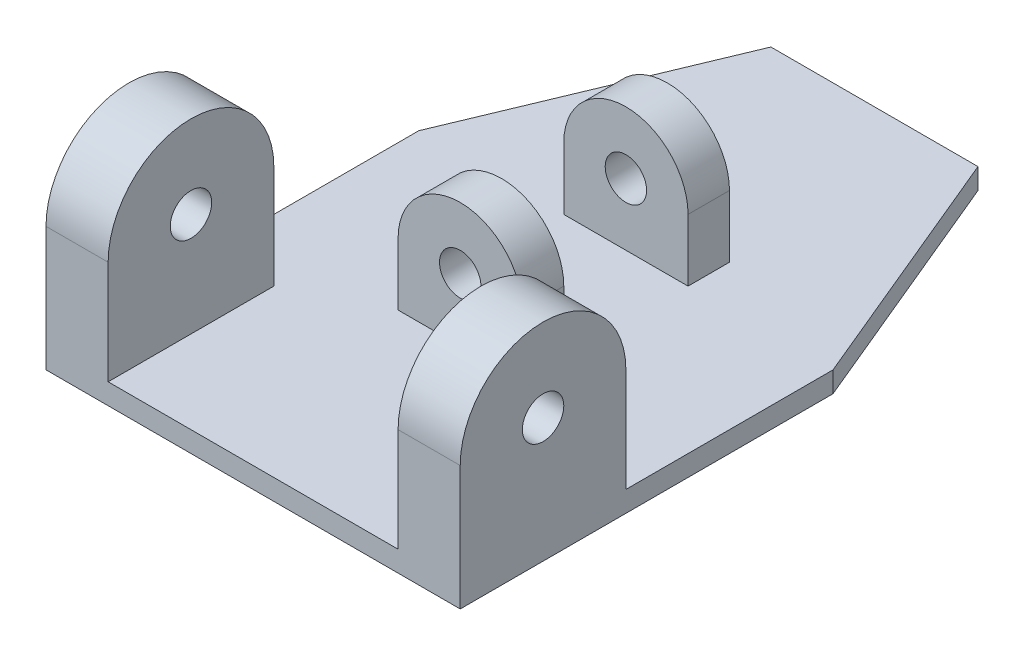
ISO-10303-21;
HEADER;
FILE_DESCRIPTION(('STEP AP214'),'2;1');
FILE_NAME('part.step','',(''),(''),'','','');
FILE_SCHEMA(('AUTOMOTIVE_DESIGN { 1 0 10303 214 1 1 1 1 }'));
ENDSEC;
DATA;
#1=APPLICATION_CONTEXT('core data for automotive mechanical design processes');
#2=APPLICATION_PROTOCOL_DEFINITION('international standard','automotive_design',2000,#1);
#3=PRODUCT_CONTEXT('',#1,'mechanical');
#4=PRODUCT('Part','Part','',(#3));
#5=PRODUCT_RELATED_PRODUCT_CATEGORY('part','',(#4));
#6=PRODUCT_DEFINITION_FORMATION('','',#4);
#7=PRODUCT_DEFINITION_CONTEXT('part definition',#1,'design');
#8=PRODUCT_DEFINITION('design','',#6,#7);
#9=PRODUCT_DEFINITION_SHAPE('','',#8);
#10=(LENGTH_UNIT() NAMED_UNIT(*) SI_UNIT(.MILLI.,.METRE.));
#11=(NAMED_UNIT(*) PLANE_ANGLE_UNIT() SI_UNIT($,.RADIAN.));
#12=(NAMED_UNIT(*) SI_UNIT($,.STERADIAN.) SOLID_ANGLE_UNIT());
#13=UNCERTAINTY_MEASURE_WITH_UNIT(LENGTH_MEASURE(1.E-05),#10,'distance_accuracy_value','');
#14=(GEOMETRIC_REPRESENTATION_CONTEXT(3) GLOBAL_UNCERTAINTY_ASSIGNED_CONTEXT((#13)) GLOBAL_UNIT_ASSIGNED_CONTEXT((#10,
#11,#12)) REPRESENTATION_CONTEXT('',''));
#15=CARTESIAN_POINT('',(0.,0.,0.));
#16=DIRECTION('',(0.,0.,1.));
#17=DIRECTION('',(1.,0.,0.));
#18=AXIS2_PLACEMENT_3D('',#15,#16,#17);
#19=CARTESIAN_POINT('',(-30.,0.,-200.));
#20=DIRECTION('',(-1.,0.,0.));
#21=DIRECTION('',(0.,-1.,0.));
#22=AXIS2_PLACEMENT_3D('',#19,#20,#21);
#23=PLANE('',#22);
#24=DIRECTION('',(0.,0.,1.));
#25=VECTOR('',#24,1.);
#26=CARTESIAN_POINT('',(-30.,40.,-200.));
#27=LINE('',#26,#25);
#28=CARTESIAN_POINT('',(-30.,40.,-120.));
#29=VERTEX_POINT('',#28);
#30=CARTESIAN_POINT('',(-30.,40.,-100.));
#31=VERTEX_POINT('',#30);
#32=EDGE_CURVE('E191',#29,#31,#27,.T.);
#33=ORIENTED_EDGE('',*,*,#32,.F.);
#34=DIRECTION('',(0.,-1.,0.));
#35=VECTOR('',#34,1.);
#36=CARTESIAN_POINT('',(-30.,0.,-120.));
#37=LINE('',#36,#35);
#38=CARTESIAN_POINT('',(-30.,10.,-120.));
#39=VERTEX_POINT('',#38);
#40=EDGE_CURVE('E178',#29,#39,#37,.T.);
#41=ORIENTED_EDGE('',*,*,#40,.T.);
#42=DIRECTION('',(0.,0.,1.));
#43=VECTOR('',#42,1.);
#44=CARTESIAN_POINT('',(-30.,10.,-200.));
#45=LINE('',#44,#43);
#46=CARTESIAN_POINT('',(-30.,10.,-100.));
#47=VERTEX_POINT('',#46);
#48=EDGE_CURVE('E189',#39,#47,#45,.T.);
#49=ORIENTED_EDGE('',*,*,#48,.T.);
#50=DIRECTION('',(0.,-1.,0.));
#51=VECTOR('',#50,1.);
#52=CARTESIAN_POINT('',(-30.,0.,-100.));
#53=LINE('',#52,#51);
#54=EDGE_CURVE('E334',#31,#47,#53,.T.);
#55=ORIENTED_EDGE('',*,*,#54,.F.);
#56=EDGE_LOOP('',(#33,#41,#49,#55));
#57=FACE_BOUND('',#56,.T.);
#58=ADVANCED_FACE('F37',(#57),#23,.T.);
#59=CARTESIAN_POINT('',(0.,40.,-200.));
#60=DIRECTION('',(0.,0.,1.));
#61=DIRECTION('',(1.,0.,0.));
#62=AXIS2_PLACEMENT_3D('',#59,#60,#61);
#63=CYLINDRICAL_SURFACE('',#62,30.);
#64=CARTESIAN_POINT('',(0.,40.,-120.));
#65=DIRECTION('',(0.,0.,-1.));
#66=DIRECTION('',(-1.,0.,0.));
#67=AXIS2_PLACEMENT_3D('',#64,#65,#66);
#68=CIRCLE('',#67,30.);
#69=CARTESIAN_POINT('',(30.,40.,-120.));
#70=VERTEX_POINT('',#69);
#71=EDGE_CURVE('E192',#29,#70,#68,.T.);
#72=ORIENTED_EDGE('',*,*,#71,.F.);
#73=ORIENTED_EDGE('',*,*,#32,.T.);
#74=CARTESIAN_POINT('',(0.,40.,-100.));
#75=DIRECTION('',(0.,0.,1.));
#76=DIRECTION('',(1.,0.,0.));
#77=AXIS2_PLACEMENT_3D('',#74,#75,#76);
#78=CIRCLE('',#77,30.);
#79=CARTESIAN_POINT('',(30.,40.,-100.));
#80=VERTEX_POINT('',#79);
#81=EDGE_CURVE('E325',#31,#80,#78,.F.);
#82=ORIENTED_EDGE('',*,*,#81,.T.);
#83=DIRECTION('',(0.,0.,1.));
#84=VECTOR('',#83,1.);
#85=CARTESIAN_POINT('',(30.,40.,-200.));
#86=LINE('',#85,#84);
#87=EDGE_CURVE('E345',#70,#80,#86,.T.);
#88=ORIENTED_EDGE('',*,*,#87,.F.);
#89=EDGE_LOOP('',(#72,#73,#82,#88));
#90=FACE_BOUND('',#89,.T.);
#91=ADVANCED_FACE('F359',(#90),#63,.T.);
#92=CARTESIAN_POINT('',(30.,0.,-200.));
#93=DIRECTION('',(-1.,0.,0.));
#94=DIRECTION('',(0.,-1.,0.));
#95=AXIS2_PLACEMENT_3D('',#92,#93,#94);
#96=PLANE('',#95);
#97=DIRECTION('',(0.,-1.,0.));
#98=VECTOR('',#97,1.);
#99=CARTESIAN_POINT('',(30.,0.,-120.));
#100=LINE('',#99,#98);
#101=CARTESIAN_POINT('',(30.,10.,-120.));
#102=VERTEX_POINT('',#101);
#103=EDGE_CURVE('E181',#70,#102,#100,.T.);
#104=ORIENTED_EDGE('',*,*,#103,.F.);
#105=ORIENTED_EDGE('',*,*,#87,.T.);
#106=DIRECTION('',(0.,-1.,0.));
#107=VECTOR('',#106,1.);
#108=CARTESIAN_POINT('',(30.,0.,-100.));
#109=LINE('',#108,#107);
#110=CARTESIAN_POINT('',(30.,10.,-100.));
#111=VERTEX_POINT('',#110);
#112=EDGE_CURVE('E337',#80,#111,#109,.T.);
#113=ORIENTED_EDGE('',*,*,#112,.T.);
#114=DIRECTION('',(0.,0.,1.));
#115=VECTOR('',#114,1.);
#116=CARTESIAN_POINT('',(30.,10.,-200.));
#117=LINE('',#116,#115);
#118=EDGE_CURVE('E201',#102,#111,#117,.T.);
#119=ORIENTED_EDGE('',*,*,#118,.F.);
#120=EDGE_LOOP('',(#104,#105,#113,#119));
#121=FACE_BOUND('',#120,.T.);
#122=ADVANCED_FACE('F356',(#121),#96,.F.);
#123=CARTESIAN_POINT('',(0.,40.,-200.));
#124=DIRECTION('',(0.,0.,1.));
#125=DIRECTION('',(1.,0.,0.));
#126=AXIS2_PLACEMENT_3D('',#123,#124,#125);
#127=CYLINDRICAL_SURFACE('',#126,10.);
#128=CARTESIAN_POINT('',(0.,40.,-100.));
#129=DIRECTION('',(0.,0.,1.));
#130=DIRECTION('',(1.,0.,0.));
#131=AXIS2_PLACEMENT_3D('',#128,#129,#130);
#132=CIRCLE('',#131,10.);
#133=CARTESIAN_POINT('',(10.,40.,-100.));
#134=VERTEX_POINT('',#133);
#135=EDGE_CURVE('E320',#134,#134,#132,.T.);
#136=ORIENTED_EDGE('',*,*,#135,.T.);
#137=EDGE_LOOP('',(#136));
#138=FACE_BOUND('',#137,.T.);
#139=CARTESIAN_POINT('',(0.,40.,-120.));
#140=DIRECTION('',(0.,0.,-1.));
#141=DIRECTION('',(-1.,0.,0.));
#142=AXIS2_PLACEMENT_3D('',#139,#140,#141);
#143=CIRCLE('',#142,10.);
#144=CARTESIAN_POINT('',(-10.,40.,-120.));
#145=VERTEX_POINT('',#144);
#146=EDGE_CURVE('E183',#145,#145,#143,.F.);
#147=ORIENTED_EDGE('',*,*,#146,.F.);
#148=EDGE_LOOP('',(#147));
#149=FACE_BOUND('',#148,.T.);
#150=ADVANCED_FACE('F358',(#138,#149),#127,.F.);
#151=CARTESIAN_POINT('',(0.,10.,0.));
#152=DIRECTION('',(0.,1.,0.));
#153=DIRECTION('',(0.,0.,1.));
#154=AXIS2_PLACEMENT_3D('',#151,#152,#153);
#155=PLANE('',#154);
#156=CARTESIAN_POINT('',(30.,10.,-200.));
#157=VERTEX_POINT('',#156);
#158=CARTESIAN_POINT('',(30.,10.,-180.));
#159=VERTEX_POINT('',#158);
#160=EDGE_CURVE('E207',#157,#159,#117,.T.);
#161=ORIENTED_EDGE('',*,*,#160,.T.);
#162=DIRECTION('',(1.,0.,0.));
#163=VECTOR('',#162,1.);
#164=CARTESIAN_POINT('',(-40.,10.,-180.));
#165=LINE('',#164,#163);
#166=CARTESIAN_POINT('',(-30.,10.,-180.));
#167=VERTEX_POINT('',#166);
#168=EDGE_CURVE('E184',#167,#159,#165,.T.);
#169=ORIENTED_EDGE('',*,*,#168,.F.);
#170=CARTESIAN_POINT('',(-30.,10.,-200.));
#171=VERTEX_POINT('',#170);
#172=EDGE_CURVE('E62',#171,#167,#45,.T.);
#173=ORIENTED_EDGE('',*,*,#172,.F.);
#174=DIRECTION('',(-1.,0.,0.));
#175=VECTOR('',#174,1.);
#176=CARTESIAN_POINT('',(0.,10.,-200.));
#177=LINE('',#176,#175);
#178=EDGE_CURVE('E328',#157,#171,#177,.T.);
#179=ORIENTED_EDGE('',*,*,#178,.F.);
#180=EDGE_LOOP('',(#161,#169,#173,#179));
#181=FACE_BOUND('',#180,.T.);
#182=DIRECTION('',(1.,0.,0.));
#183=VECTOR('',#182,1.);
#184=CARTESIAN_POINT('',(-40.,10.,-120.));
#185=LINE('',#184,#183);
#186=EDGE_CURVE('E54',#39,#102,#185,.T.);
#187=ORIENTED_EDGE('',*,*,#186,.T.);
#188=ORIENTED_EDGE('',*,*,#118,.T.);
#189=DIRECTION('',(-1.,0.,0.));
#190=VECTOR('',#189,1.);
#191=CARTESIAN_POINT('',(0.,10.,-100.));
#192=LINE('',#191,#190);
#193=EDGE_CURVE('E197',#111,#47,#192,.T.);
#194=ORIENTED_EDGE('',*,*,#193,.T.);
#195=ORIENTED_EDGE('',*,*,#48,.F.);
#196=EDGE_LOOP('',(#187,#188,#194,#195));
#197=FACE_BOUND('',#196,.T.);
#198=DIRECTION('',(0.,0.,-1.));
#199=VECTOR('',#198,1.);
#200=CARTESIAN_POINT('',(70.,10.,0.));
#201=LINE('',#200,#199);
#202=CARTESIAN_POINT('',(70.,10.,0.));
#203=VERTEX_POINT('',#202);
#204=CARTESIAN_POINT('',(70.,10.,-80.));
#205=VERTEX_POINT('',#204);
#206=EDGE_CURVE('E214',#203,#205,#201,.T.);
#207=ORIENTED_EDGE('',*,*,#206,.T.);
#208=DIRECTION('',(1.,0.,0.));
#209=VECTOR('',#208,1.);
#210=CARTESIAN_POINT('',(-220.415945787923,10.,-80.));
#211=LINE('',#210,#209);
#212=CARTESIAN_POINT('',(100.,10.,-80.));
#213=VERTEX_POINT('',#212);
#214=EDGE_CURVE('E260',#205,#213,#211,.T.);
#215=ORIENTED_EDGE('',*,*,#214,.T.);
#216=DIRECTION('',(0.,0.,-1.));
#217=VECTOR('',#216,1.);
#218=CARTESIAN_POINT('',(100.,10.,0.));
#219=LINE('',#218,#217);
#220=CARTESIAN_POINT('',(100.,10.,-180.));
#221=VERTEX_POINT('',#220);
#222=EDGE_CURVE('E264',#213,#221,#219,.T.);
#223=ORIENTED_EDGE('',*,*,#222,.T.);
#224=DIRECTION('',(-0.384615384615385,0.,-0.923076923076923));
#225=VECTOR('',#224,1.);
#226=CARTESIAN_POINT('',(100.,10.,-180.));
#227=LINE('',#226,#225);
#228=CARTESIAN_POINT('',(50.,10.,-300.));
#229=VERTEX_POINT('',#228);
#230=EDGE_CURVE('E266',#221,#229,#227,.T.);
#231=ORIENTED_EDGE('',*,*,#230,.T.);
#232=DIRECTION('',(-1.,0.,0.));
#233=VECTOR('',#232,1.);
#234=CARTESIAN_POINT('',(50.,10.,-300.));
#235=LINE('',#234,#233);
#236=CARTESIAN_POINT('',(-50.,10.,-300.));
#237=VERTEX_POINT('',#236);
#238=EDGE_CURVE('E269',#229,#237,#235,.T.);
#239=ORIENTED_EDGE('',*,*,#238,.T.);
#240=DIRECTION('',(-0.384615384615385,0.,0.923076923076923));
#241=VECTOR('',#240,1.);
#242=CARTESIAN_POINT('',(-100.,10.,-180.));
#243=LINE('',#242,#241);
#244=CARTESIAN_POINT('',(-100.,10.,-180.));
#245=VERTEX_POINT('',#244);
#246=EDGE_CURVE('E271',#237,#245,#243,.T.);
#247=ORIENTED_EDGE('',*,*,#246,.T.);
#248=DIRECTION('',(0.,0.,1.));
#249=VECTOR('',#248,1.);
#250=CARTESIAN_POINT('',(-100.,10.,0.));
#251=LINE('',#250,#249);
#252=CARTESIAN_POINT('',(-100.,10.,-80.));
#253=VERTEX_POINT('',#252);
#254=EDGE_CURVE('E273',#245,#253,#251,.T.);
#255=ORIENTED_EDGE('',*,*,#254,.T.);
#256=CARTESIAN_POINT('',(-70.,10.,-80.));
#257=VERTEX_POINT('',#256);
#258=EDGE_CURVE('E257',#253,#257,#211,.T.);
#259=ORIENTED_EDGE('',*,*,#258,.T.);
#260=DIRECTION('',(0.,0.,1.));
#261=VECTOR('',#260,1.);
#262=CARTESIAN_POINT('',(-70.,10.,0.));
#263=LINE('',#262,#261);
#264=CARTESIAN_POINT('',(-70.,10.,0.));
#265=VERTEX_POINT('',#264);
#266=EDGE_CURVE('E209',#257,#265,#263,.T.);
#267=ORIENTED_EDGE('',*,*,#266,.T.);
#268=DIRECTION('',(1.,0.,0.));
#269=VECTOR('',#268,1.);
#270=CARTESIAN_POINT('',(-70.,10.,0.));
#271=LINE('',#270,#269);
#272=EDGE_CURVE('E211',#265,#203,#271,.T.);
#273=ORIENTED_EDGE('',*,*,#272,.T.);
#274=EDGE_LOOP('',(#207,#215,#223,#231,#239,#247,#255,#259,#267,#273));
#275=FACE_BOUND('',#274,.T.);
#276=ADVANCED_FACE('F194',(#181,#197,#275),#155,.T.);
#277=CARTESIAN_POINT('',(-100.,10.,0.));
#278=DIRECTION('',(0.,0.,-1.));
#279=DIRECTION('',(-1.,0.,0.));
#280=AXIS2_PLACEMENT_3D('',#277,#278,#279);
#281=PLANE('',#280);
#282=DIRECTION('',(0.,-1.,0.));
#283=VECTOR('',#282,1.);
#284=CARTESIAN_POINT('',(-70.,181.,0.));
#285=LINE('',#284,#283);
#286=CARTESIAN_POINT('',(-70.,60.,0.));
#287=VERTEX_POINT('',#286);
#288=EDGE_CURVE('E220',#287,#265,#285,.T.);
#289=ORIENTED_EDGE('',*,*,#288,.F.);
#290=DIRECTION('',(1.,0.,0.));
#291=VECTOR('',#290,1.);
#292=CARTESIAN_POINT('',(-220.415945787923,60.,0.));
#293=LINE('',#292,#291);
#294=CARTESIAN_POINT('',(-100.,60.,0.));
#295=VERTEX_POINT('',#294);
#296=EDGE_CURVE('E261',#295,#287,#293,.T.);
#297=ORIENTED_EDGE('',*,*,#296,.F.);
#298=DIRECTION('',(0.,-1.,0.));
#299=VECTOR('',#298,1.);
#300=CARTESIAN_POINT('',(-100.,10.,0.));
#301=LINE('',#300,#299);
#302=CARTESIAN_POINT('',(-100.,0.,0.));
#303=VERTEX_POINT('',#302);
#304=EDGE_CURVE('E290',#295,#303,#301,.T.);
#305=ORIENTED_EDGE('',*,*,#304,.T.);
#306=DIRECTION('',(1.,0.,0.));
#307=VECTOR('',#306,1.);
#308=CARTESIAN_POINT('',(-100.,0.,0.));
#309=LINE('',#308,#307);
#310=CARTESIAN_POINT('',(100.,0.,0.));
#311=VERTEX_POINT('',#310);
#312=EDGE_CURVE('E267',#303,#311,#309,.T.);
#313=ORIENTED_EDGE('',*,*,#312,.T.);
#314=DIRECTION('',(0.,-1.,0.));
#315=VECTOR('',#314,1.);
#316=CARTESIAN_POINT('',(100.,10.,0.));
#317=LINE('',#316,#315);
#318=CARTESIAN_POINT('',(100.,60.,0.));
#319=VERTEX_POINT('',#318);
#320=EDGE_CURVE('E276',#319,#311,#317,.T.);
#321=ORIENTED_EDGE('',*,*,#320,.F.);
#322=CARTESIAN_POINT('',(70.,60.,0.));
#323=VERTEX_POINT('',#322);
#324=EDGE_CURVE('E253',#323,#319,#293,.T.);
#325=ORIENTED_EDGE('',*,*,#324,.F.);
#326=DIRECTION('',(0.,-1.,0.));
#327=VECTOR('',#326,1.);
#328=CARTESIAN_POINT('',(70.,181.,0.));
#329=LINE('',#328,#327);
#330=EDGE_CURVE('E217',#323,#203,#329,.T.);
#331=ORIENTED_EDGE('',*,*,#330,.T.);
#332=ORIENTED_EDGE('',*,*,#272,.F.);
#333=EDGE_LOOP('',(#289,#297,#305,#313,#321,#325,#331,#332));
#334=FACE_BOUND('',#333,.T.);
#335=ADVANCED_FACE('F396',(#334),#281,.F.);
#336=CARTESIAN_POINT('',(-220.415945787923,60.,-40.));
#337=DIRECTION('',(1.,0.,0.));
#338=DIRECTION('',(0.,0.,-1.));
#339=AXIS2_PLACEMENT_3D('',#336,#337,#338);
#340=CYLINDRICAL_SURFACE('',#339,10.);
#341=CARTESIAN_POINT('',(-100.,60.,-40.));
#342=DIRECTION('',(1.,0.,0.));
#343=DIRECTION('',(0.,0.,-1.));
#344=AXIS2_PLACEMENT_3D('',#341,#342,#343);
#345=CIRCLE('',#344,10.);
#346=CARTESIAN_POINT('',(-100.,60.,-50.));
#347=VERTEX_POINT('',#346);
#348=EDGE_CURVE('E241',#347,#347,#345,.F.);
#349=ORIENTED_EDGE('',*,*,#348,.T.);
#350=EDGE_LOOP('',(#349));
#351=FACE_BOUND('',#350,.T.);
#352=CARTESIAN_POINT('',(-70.,60.,-40.));
#353=DIRECTION('',(1.,0.,0.));
#354=DIRECTION('',(0.,0.,-1.));
#355=AXIS2_PLACEMENT_3D('',#352,#353,#354);
#356=CIRCLE('',#355,10.);
#357=CARTESIAN_POINT('',(-70.,60.,-50.));
#358=VERTEX_POINT('',#357);
#359=EDGE_CURVE('E232',#358,#358,#356,.F.);
#360=ORIENTED_EDGE('',*,*,#359,.F.);
#361=EDGE_LOOP('',(#360));
#362=FACE_BOUND('',#361,.T.);
#363=ADVANCED_FACE('F401',(#351,#362),#340,.F.);
#364=CARTESIAN_POINT('',(100.,60.,-40.));
#365=DIRECTION('',(1.,0.,0.));
#366=DIRECTION('',(0.,0.,-1.));
#367=AXIS2_PLACEMENT_3D('',#364,#365,#366);
#368=CIRCLE('',#367,10.);
#369=CARTESIAN_POINT('',(100.,60.,-50.));
#370=VERTEX_POINT('',#369);
#371=EDGE_CURVE('E235',#370,#370,#368,.T.);
#372=ORIENTED_EDGE('',*,*,#371,.T.);
#373=EDGE_LOOP('',(#372));
#374=FACE_BOUND('',#373,.T.);
#375=CARTESIAN_POINT('',(70.,60.,-40.));
#376=DIRECTION('',(-1.,0.,0.));
#377=DIRECTION('',(0.,0.,1.));
#378=AXIS2_PLACEMENT_3D('',#375,#376,#377);
#379=CIRCLE('',#378,10.);
#380=CARTESIAN_POINT('',(70.,60.,-30.));
#381=VERTEX_POINT('',#380);
#382=EDGE_CURVE('E226',#381,#381,#379,.F.);
#383=ORIENTED_EDGE('',*,*,#382,.F.);
#384=EDGE_LOOP('',(#383));
#385=FACE_BOUND('',#384,.T.);
#386=ADVANCED_FACE('F476',(#374,#385),#340,.F.);
#387=CARTESIAN_POINT('',(-220.415945787923,0.,-80.));
#388=DIRECTION('',(0.,0.,-1.));
#389=DIRECTION('',(0.,1.,0.));
#390=AXIS2_PLACEMENT_3D('',#387,#388,#389);
#391=PLANE('',#390);
#392=DIRECTION('',(1.,0.,0.));
#393=VECTOR('',#392,1.);
#394=CARTESIAN_POINT('',(-220.415945787923,60.,-80.));
#395=LINE('',#394,#393);
#396=CARTESIAN_POINT('',(-100.,60.,-80.));
#397=VERTEX_POINT('',#396);
#398=CARTESIAN_POINT('',(-70.,60.,-80.));
#399=VERTEX_POINT('',#398);
#400=EDGE_CURVE('E239',#397,#399,#395,.T.);
#401=ORIENTED_EDGE('',*,*,#400,.T.);
#402=DIRECTION('',(0.,-1.,0.));
#403=VECTOR('',#402,1.);
#404=CARTESIAN_POINT('',(-70.,0.,-80.));
#405=LINE('',#404,#403);
#406=EDGE_CURVE('E229',#399,#257,#405,.T.);
#407=ORIENTED_EDGE('',*,*,#406,.T.);
#408=ORIENTED_EDGE('',*,*,#258,.F.);
#409=DIRECTION('',(0.,-1.,0.));
#410=VECTOR('',#409,1.);
#411=CARTESIAN_POINT('',(-100.,0.,-80.));
#412=LINE('',#411,#410);
#413=EDGE_CURVE('E236',#397,#253,#412,.T.);
#414=ORIENTED_EDGE('',*,*,#413,.F.);
#415=EDGE_LOOP('',(#401,#407,#408,#414));
#416=FACE_BOUND('',#415,.T.);
#417=ADVANCED_FACE('F457',(#416),#391,.T.);
#418=ORIENTED_EDGE('',*,*,#214,.F.);
#419=DIRECTION('',(0.,1.,0.));
#420=VECTOR('',#419,1.);
#421=CARTESIAN_POINT('',(70.,0.,-80.));
#422=LINE('',#421,#420);
#423=CARTESIAN_POINT('',(70.,60.,-80.));
#424=VERTEX_POINT('',#423);
#425=EDGE_CURVE('E223',#205,#424,#422,.T.);
#426=ORIENTED_EDGE('',*,*,#425,.T.);
#427=CARTESIAN_POINT('',(100.,60.,-80.));
#428=VERTEX_POINT('',#427);
#429=EDGE_CURVE('E256',#424,#428,#395,.T.);
#430=ORIENTED_EDGE('',*,*,#429,.T.);
#431=DIRECTION('',(0.,1.,0.));
#432=VECTOR('',#431,1.);
#433=CARTESIAN_POINT('',(100.,0.,-80.));
#434=LINE('',#433,#432);
#435=EDGE_CURVE('E250',#213,#428,#434,.T.);
#436=ORIENTED_EDGE('',*,*,#435,.F.);
#437=EDGE_LOOP('',(#418,#426,#430,#436));
#438=FACE_BOUND('',#437,.T.);
#439=ADVANCED_FACE('F468',(#438),#391,.T.);
#440=CARTESIAN_POINT('',(-220.415945787923,60.,-40.));
#441=DIRECTION('',(1.,0.,0.));
#442=DIRECTION('',(0.,0.,-1.));
#443=AXIS2_PLACEMENT_3D('',#440,#441,#442);
#444=CYLINDRICAL_SURFACE('',#443,40.);
#445=ORIENTED_EDGE('',*,*,#296,.T.);
#446=CARTESIAN_POINT('',(-70.,60.,-40.));
#447=DIRECTION('',(1.,0.,0.));
#448=DIRECTION('',(0.,0.,-1.));
#449=AXIS2_PLACEMENT_3D('',#446,#447,#448);
#450=CIRCLE('',#449,40.);
#451=EDGE_CURVE('E11',#287,#399,#450,.F.);
#452=ORIENTED_EDGE('',*,*,#451,.T.);
#453=ORIENTED_EDGE('',*,*,#400,.F.);
#454=CARTESIAN_POINT('',(-100.,60.,-40.));
#455=DIRECTION('',(1.,0.,0.));
#456=DIRECTION('',(0.,0.,-1.));
#457=AXIS2_PLACEMENT_3D('',#454,#455,#456);
#458=CIRCLE('',#457,40.);
#459=EDGE_CURVE('E238',#295,#397,#458,.F.);
#460=ORIENTED_EDGE('',*,*,#459,.F.);
#461=EDGE_LOOP('',(#445,#452,#453,#460));
#462=FACE_BOUND('',#461,.T.);
#463=ADVANCED_FACE('F455',(#462),#444,.T.);
#464=ORIENTED_EDGE('',*,*,#429,.F.);
#465=CARTESIAN_POINT('',(70.,60.,-40.));
#466=DIRECTION('',(-1.,0.,0.));
#467=DIRECTION('',(0.,0.,1.));
#468=AXIS2_PLACEMENT_3D('',#465,#466,#467);
#469=CIRCLE('',#468,40.);
#470=EDGE_CURVE('E46',#424,#323,#469,.F.);
#471=ORIENTED_EDGE('',*,*,#470,.T.);
#472=ORIENTED_EDGE('',*,*,#324,.T.);
#473=CARTESIAN_POINT('',(100.,60.,-40.));
#474=DIRECTION('',(1.,0.,0.));
#475=DIRECTION('',(0.,0.,-1.));
#476=AXIS2_PLACEMENT_3D('',#473,#474,#475);
#477=CIRCLE('',#476,40.);
#478=EDGE_CURVE('E247',#428,#319,#477,.T.);
#479=ORIENTED_EDGE('',*,*,#478,.F.);
#480=EDGE_LOOP('',(#464,#471,#472,#479));
#481=FACE_BOUND('',#480,.T.);
#482=ADVANCED_FACE('F428',(#481),#444,.T.);
#483=CARTESIAN_POINT('',(100.,10.,0.));
#484=DIRECTION('',(-1.,0.,0.));
#485=DIRECTION('',(0.,0.,1.));
#486=AXIS2_PLACEMENT_3D('',#483,#484,#485);
#487=PLANE('',#486);
#488=DIRECTION('',(0.,0.,-1.));
#489=VECTOR('',#488,1.);
#490=CARTESIAN_POINT('',(100.,0.,0.));
#491=LINE('',#490,#489);
#492=CARTESIAN_POINT('',(100.,0.,-180.));
#493=VERTEX_POINT('',#492);
#494=EDGE_CURVE('E244',#311,#493,#491,.T.);
#495=ORIENTED_EDGE('',*,*,#494,.T.);
#496=DIRECTION('',(0.,-1.,0.));
#497=VECTOR('',#496,1.);
#498=CARTESIAN_POINT('',(100.,10.,-180.));
#499=LINE('',#498,#497);
#500=EDGE_CURVE('E302',#221,#493,#499,.T.);
#501=ORIENTED_EDGE('',*,*,#500,.F.);
#502=ORIENTED_EDGE('',*,*,#222,.F.);
#503=ORIENTED_EDGE('',*,*,#435,.T.);
#504=ORIENTED_EDGE('',*,*,#478,.T.);
#505=ORIENTED_EDGE('',*,*,#320,.T.);
#506=EDGE_LOOP('',(#495,#501,#502,#503,#504,#505));
#507=FACE_BOUND('',#506,.T.);
#508=ORIENTED_EDGE('',*,*,#371,.F.);
#509=EDGE_LOOP('',(#508));
#510=FACE_BOUND('',#509,.T.);
#511=ADVANCED_FACE('F39',(#507,#510),#487,.F.);
#512=CARTESIAN_POINT('',(100.,10.,-180.));
#513=DIRECTION('',(-0.923076923076923,0.,0.384615384615385));
#514=DIRECTION('',(0.384615384615385,0.,0.923076923076923));
#515=AXIS2_PLACEMENT_3D('',#512,#513,#514);
#516=PLANE('',#515);
#517=DIRECTION('',(-0.384615384615385,0.,-0.923076923076923));
#518=VECTOR('',#517,1.);
#519=CARTESIAN_POINT('',(100.,0.,-180.));
#520=LINE('',#519,#518);
#521=CARTESIAN_POINT('',(50.,0.,-300.));
#522=VERTEX_POINT('',#521);
#523=EDGE_CURVE('E279',#493,#522,#520,.T.);
#524=ORIENTED_EDGE('',*,*,#523,.T.);
#525=DIRECTION('',(0.,-1.,0.));
#526=VECTOR('',#525,1.);
#527=CARTESIAN_POINT('',(50.,10.,-300.));
#528=LINE('',#527,#526);
#529=EDGE_CURVE('E299',#229,#522,#528,.T.);
#530=ORIENTED_EDGE('',*,*,#529,.F.);
#531=ORIENTED_EDGE('',*,*,#230,.F.);
#532=ORIENTED_EDGE('',*,*,#500,.T.);
#533=EDGE_LOOP('',(#524,#530,#531,#532));
#534=FACE_BOUND('',#533,.T.);
#535=ADVANCED_FACE('F421',(#534),#516,.F.);
#536=CARTESIAN_POINT('',(50.,10.,-300.));
#537=DIRECTION('',(0.,0.,1.));
#538=DIRECTION('',(1.,0.,0.));
#539=AXIS2_PLACEMENT_3D('',#536,#537,#538);
#540=PLANE('',#539);
#541=DIRECTION('',(-1.,0.,0.));
#542=VECTOR('',#541,1.);
#543=CARTESIAN_POINT('',(50.,0.,-300.));
#544=LINE('',#543,#542);
#545=CARTESIAN_POINT('',(-50.,0.,-300.));
#546=VERTEX_POINT('',#545);
#547=EDGE_CURVE('E281',#522,#546,#544,.T.);
#548=ORIENTED_EDGE('',*,*,#547,.T.);
#549=DIRECTION('',(0.,-1.,0.));
#550=VECTOR('',#549,1.);
#551=CARTESIAN_POINT('',(-50.,10.,-300.));
#552=LINE('',#551,#550);
#553=EDGE_CURVE('E296',#237,#546,#552,.T.);
#554=ORIENTED_EDGE('',*,*,#553,.F.);
#555=ORIENTED_EDGE('',*,*,#238,.F.);
#556=ORIENTED_EDGE('',*,*,#529,.T.);
#557=EDGE_LOOP('',(#548,#554,#555,#556));
#558=FACE_BOUND('',#557,.T.);
#559=ADVANCED_FACE('F418',(#558),#540,.F.);
#560=CARTESIAN_POINT('',(-100.,10.,-180.));
#561=DIRECTION('',(0.923076923076923,0.,0.384615384615385));
#562=DIRECTION('',(0.384615384615385,0.,-0.923076923076923));
#563=AXIS2_PLACEMENT_3D('',#560,#561,#562);
#564=PLANE('',#563);
#565=DIRECTION('',(-0.384615384615385,0.,0.923076923076923));
#566=VECTOR('',#565,1.);
#567=CARTESIAN_POINT('',(-100.,0.,-180.));
#568=LINE('',#567,#566);
#569=CARTESIAN_POINT('',(-100.,0.,-180.));
#570=VERTEX_POINT('',#569);
#571=EDGE_CURVE('E283',#546,#570,#568,.T.);
#572=ORIENTED_EDGE('',*,*,#571,.T.);
#573=DIRECTION('',(0.,-1.,0.));
#574=VECTOR('',#573,1.);
#575=CARTESIAN_POINT('',(-100.,10.,-180.));
#576=LINE('',#575,#574);
#577=EDGE_CURVE('E293',#245,#570,#576,.T.);
#578=ORIENTED_EDGE('',*,*,#577,.F.);
#579=ORIENTED_EDGE('',*,*,#246,.F.);
#580=ORIENTED_EDGE('',*,*,#553,.T.);
#581=EDGE_LOOP('',(#572,#578,#579,#580));
#582=FACE_BOUND('',#581,.T.);
#583=ADVANCED_FACE('F414',(#582),#564,.F.);
#584=CARTESIAN_POINT('',(-100.,10.,0.));
#585=DIRECTION('',(1.,0.,0.));
#586=DIRECTION('',(0.,0.,-1.));
#587=AXIS2_PLACEMENT_3D('',#584,#585,#586);
#588=PLANE('',#587);
#589=DIRECTION('',(0.,0.,1.));
#590=VECTOR('',#589,1.);
#591=CARTESIAN_POINT('',(-100.,0.,0.));
#592=LINE('',#591,#590);
#593=EDGE_CURVE('E285',#570,#303,#592,.T.);
#594=ORIENTED_EDGE('',*,*,#593,.T.);
#595=ORIENTED_EDGE('',*,*,#304,.F.);
#596=ORIENTED_EDGE('',*,*,#459,.T.);
#597=ORIENTED_EDGE('',*,*,#413,.T.);
#598=ORIENTED_EDGE('',*,*,#254,.F.);
#599=ORIENTED_EDGE('',*,*,#577,.T.);
#600=EDGE_LOOP('',(#594,#595,#596,#597,#598,#599));
#601=FACE_BOUND('',#600,.T.);
#602=ORIENTED_EDGE('',*,*,#348,.F.);
#603=EDGE_LOOP('',(#602));
#604=FACE_BOUND('',#603,.T.);
#605=ADVANCED_FACE('F409',(#601,#604),#588,.F.);
#606=CARTESIAN_POINT('',(0.,0.,0.));
#607=DIRECTION('',(0.,1.,0.));
#608=DIRECTION('',(0.,0.,1.));
#609=AXIS2_PLACEMENT_3D('',#606,#607,#608);
#610=PLANE('',#609);
#611=ORIENTED_EDGE('',*,*,#494,.F.);
#612=ORIENTED_EDGE('',*,*,#312,.F.);
#613=ORIENTED_EDGE('',*,*,#593,.F.);
#614=ORIENTED_EDGE('',*,*,#571,.F.);
#615=ORIENTED_EDGE('',*,*,#547,.F.);
#616=ORIENTED_EDGE('',*,*,#523,.F.);
#617=EDGE_LOOP('',(#611,#612,#613,#614,#615,#616));
#618=FACE_BOUND('',#617,.T.);
#619=ADVANCED_FACE('F407',(#618),#610,.F.);
#620=CARTESIAN_POINT('',(-70.,181.,0.));
#621=DIRECTION('',(1.,0.,0.));
#622=DIRECTION('',(0.,0.,-1.));
#623=AXIS2_PLACEMENT_3D('',#620,#621,#622);
#624=PLANE('',#623);
#625=ORIENTED_EDGE('',*,*,#451,.F.);
#626=ORIENTED_EDGE('',*,*,#288,.T.);
#627=ORIENTED_EDGE('',*,*,#266,.F.);
#628=ORIENTED_EDGE('',*,*,#406,.F.);
#629=EDGE_LOOP('',(#625,#626,#627,#628));
#630=FACE_BOUND('',#629,.T.);
#631=ORIENTED_EDGE('',*,*,#359,.T.);
#632=EDGE_LOOP('',(#631));
#633=FACE_BOUND('',#632,.T.);
#634=ADVANCED_FACE('F386',(#630,#633),#624,.T.);
#635=CARTESIAN_POINT('',(70.,181.,0.));
#636=DIRECTION('',(-1.,0.,0.));
#637=DIRECTION('',(0.,0.,1.));
#638=AXIS2_PLACEMENT_3D('',#635,#636,#637);
#639=PLANE('',#638);
#640=ORIENTED_EDGE('',*,*,#206,.F.);
#641=ORIENTED_EDGE('',*,*,#330,.F.);
#642=ORIENTED_EDGE('',*,*,#470,.F.);
#643=ORIENTED_EDGE('',*,*,#425,.F.);
#644=EDGE_LOOP('',(#640,#641,#642,#643));
#645=FACE_BOUND('',#644,.T.);
#646=ORIENTED_EDGE('',*,*,#382,.T.);
#647=EDGE_LOOP('',(#646));
#648=FACE_BOUND('',#647,.T.);
#649=ADVANCED_FACE('F379',(#645,#648),#639,.T.);
#650=DIRECTION('',(0.,-1.,0.));
#651=VECTOR('',#650,1.);
#652=CARTESIAN_POINT('',(-30.,0.,-180.));
#653=LINE('',#652,#651);
#654=CARTESIAN_POINT('',(-30.,40.,-180.));
#655=VERTEX_POINT('',#654);
#656=EDGE_CURVE('E318',#655,#167,#653,.T.);
#657=ORIENTED_EDGE('',*,*,#656,.F.);
#658=CARTESIAN_POINT('',(-30.,40.,-200.));
#659=VERTEX_POINT('',#658);
#660=EDGE_CURVE('E212',#659,#655,#27,.T.);
#661=ORIENTED_EDGE('',*,*,#660,.F.);
#662=DIRECTION('',(0.,-1.,0.));
#663=VECTOR('',#662,1.);
#664=CARTESIAN_POINT('',(-30.,0.,-200.));
#665=LINE('',#664,#663);
#666=EDGE_CURVE('E324',#659,#171,#665,.T.);
#667=ORIENTED_EDGE('',*,*,#666,.T.);
#668=ORIENTED_EDGE('',*,*,#172,.T.);
#669=EDGE_LOOP('',(#657,#661,#667,#668));
#670=FACE_BOUND('',#669,.T.);
#671=ADVANCED_FACE('F375',(#670),#23,.T.);
#672=ORIENTED_EDGE('',*,*,#660,.T.);
#673=CARTESIAN_POINT('',(0.,40.,-180.));
#674=DIRECTION('',(0.,0.,-1.));
#675=DIRECTION('',(-1.,0.,0.));
#676=AXIS2_PLACEMENT_3D('',#673,#674,#675);
#677=CIRCLE('',#676,30.);
#678=CARTESIAN_POINT('',(30.,40.,-180.));
#679=VERTEX_POINT('',#678);
#680=EDGE_CURVE('E315',#655,#679,#677,.T.);
#681=ORIENTED_EDGE('',*,*,#680,.T.);
#682=CARTESIAN_POINT('',(30.,40.,-200.));
#683=VERTEX_POINT('',#682);
#684=EDGE_CURVE('E343',#683,#679,#86,.T.);
#685=ORIENTED_EDGE('',*,*,#684,.F.);
#686=CARTESIAN_POINT('',(0.,40.,-200.));
#687=DIRECTION('',(0.,0.,1.));
#688=DIRECTION('',(1.,0.,0.));
#689=AXIS2_PLACEMENT_3D('',#686,#687,#688);
#690=CIRCLE('',#689,30.);
#691=EDGE_CURVE('E199',#659,#683,#690,.F.);
#692=ORIENTED_EDGE('',*,*,#691,.F.);
#693=EDGE_LOOP('',(#672,#681,#685,#692));
#694=FACE_BOUND('',#693,.T.);
#695=ADVANCED_FACE('F371',(#694),#63,.T.);
#696=ORIENTED_EDGE('',*,*,#684,.T.);
#697=DIRECTION('',(0.,-1.,0.));
#698=VECTOR('',#697,1.);
#699=CARTESIAN_POINT('',(30.,0.,-180.));
#700=LINE('',#699,#698);
#701=EDGE_CURVE('E312',#679,#159,#700,.T.);
#702=ORIENTED_EDGE('',*,*,#701,.T.);
#703=ORIENTED_EDGE('',*,*,#160,.F.);
#704=DIRECTION('',(0.,-1.,0.));
#705=VECTOR('',#704,1.);
#706=CARTESIAN_POINT('',(30.,0.,-200.));
#707=LINE('',#706,#705);
#708=EDGE_CURVE('E203',#683,#157,#707,.T.);
#709=ORIENTED_EDGE('',*,*,#708,.F.);
#710=EDGE_LOOP('',(#696,#702,#703,#709));
#711=FACE_BOUND('',#710,.T.);
#712=ADVANCED_FACE('F361',(#711),#96,.F.);
#713=CARTESIAN_POINT('',(0.,40.,-180.));
#714=DIRECTION('',(0.,0.,-1.));
#715=DIRECTION('',(-1.,0.,0.));
#716=AXIS2_PLACEMENT_3D('',#713,#714,#715);
#717=CIRCLE('',#716,10.);
#718=CARTESIAN_POINT('',(-10.,40.,-180.));
#719=VERTEX_POINT('',#718);
#720=EDGE_CURVE('E41',#719,#719,#717,.F.);
#721=ORIENTED_EDGE('',*,*,#720,.T.);
#722=EDGE_LOOP('',(#721));
#723=FACE_BOUND('',#722,.T.);
#724=CARTESIAN_POINT('',(0.,40.,-200.));
#725=DIRECTION('',(0.,0.,1.));
#726=DIRECTION('',(1.,0.,0.));
#727=AXIS2_PLACEMENT_3D('',#724,#725,#726);
#728=CIRCLE('',#727,10.);
#729=CARTESIAN_POINT('',(10.,40.,-200.));
#730=VERTEX_POINT('',#729);
#731=EDGE_CURVE('E321',#730,#730,#728,.T.);
#732=ORIENTED_EDGE('',*,*,#731,.F.);
#733=EDGE_LOOP('',(#732));
#734=FACE_BOUND('',#733,.T.);
#735=ADVANCED_FACE('F368',(#723,#734),#127,.F.);
#736=CARTESIAN_POINT('',(0.,0.,-200.));
#737=DIRECTION('',(0.,0.,1.));
#738=DIRECTION('',(1.,0.,0.));
#739=AXIS2_PLACEMENT_3D('',#736,#737,#738);
#740=PLANE('',#739);
#741=ORIENTED_EDGE('',*,*,#731,.T.);
#742=EDGE_LOOP('',(#741));
#743=FACE_BOUND('',#742,.T.);
#744=ORIENTED_EDGE('',*,*,#666,.F.);
#745=ORIENTED_EDGE('',*,*,#691,.T.);
#746=ORIENTED_EDGE('',*,*,#708,.T.);
#747=ORIENTED_EDGE('',*,*,#178,.T.);
#748=EDGE_LOOP('',(#744,#745,#746,#747));
#749=FACE_BOUND('',#748,.T.);
#750=ADVANCED_FACE('F394',(#743,#749),#740,.F.);
#751=CARTESIAN_POINT('',(0.,0.,-100.));
#752=DIRECTION('',(0.,0.,1.));
#753=DIRECTION('',(1.,0.,0.));
#754=AXIS2_PLACEMENT_3D('',#751,#752,#753);
#755=PLANE('',#754);
#756=ORIENTED_EDGE('',*,*,#135,.F.);
#757=EDGE_LOOP('',(#756));
#758=FACE_BOUND('',#757,.T.);
#759=ORIENTED_EDGE('',*,*,#54,.T.);
#760=ORIENTED_EDGE('',*,*,#193,.F.);
#761=ORIENTED_EDGE('',*,*,#112,.F.);
#762=ORIENTED_EDGE('',*,*,#81,.F.);
#763=EDGE_LOOP('',(#759,#760,#761,#762));
#764=FACE_BOUND('',#763,.T.);
#765=ADVANCED_FACE('F354',(#758,#764),#755,.T.);
#766=CARTESIAN_POINT('',(-40.,120.,-180.));
#767=DIRECTION('',(0.,0.,-1.));
#768=DIRECTION('',(-1.,0.,0.));
#769=AXIS2_PLACEMENT_3D('',#766,#767,#768);
#770=PLANE('',#769);
#771=ORIENTED_EDGE('',*,*,#656,.T.);
#772=ORIENTED_EDGE('',*,*,#168,.T.);
#773=ORIENTED_EDGE('',*,*,#701,.F.);
#774=ORIENTED_EDGE('',*,*,#680,.F.);
#775=EDGE_LOOP('',(#771,#772,#773,#774));
#776=FACE_BOUND('',#775,.T.);
#777=ORIENTED_EDGE('',*,*,#720,.F.);
#778=EDGE_LOOP('',(#777));
#779=FACE_BOUND('',#778,.T.);
#780=ADVANCED_FACE('F491',(#776,#779),#770,.F.);
#781=CARTESIAN_POINT('',(-40.,120.,-120.));
#782=DIRECTION('',(0.,0.,-1.));
#783=DIRECTION('',(-1.,0.,0.));
#784=AXIS2_PLACEMENT_3D('',#781,#782,#783);
#785=PLANE('',#784);
#786=ORIENTED_EDGE('',*,*,#71,.T.);
#787=ORIENTED_EDGE('',*,*,#103,.T.);
#788=ORIENTED_EDGE('',*,*,#186,.F.);
#789=ORIENTED_EDGE('',*,*,#40,.F.);
#790=EDGE_LOOP('',(#786,#787,#788,#789));
#791=FACE_BOUND('',#790,.T.);
#792=ORIENTED_EDGE('',*,*,#146,.T.);
#793=EDGE_LOOP('',(#792));
#794=FACE_BOUND('',#793,.T.);
#795=ADVANCED_FACE('F176',(#791,#794),#785,.T.);
#796=CLOSED_SHELL('',(#58,#91,#122,#150,#276,#335,#363,#386,#417,#439,#463,#482,#511,#535,#559,
#583,#605,#619,#634,#649,#671,#695,#712,#735,#750,#765,#780,#795));
#797=MANIFOLD_SOLID_BREP('B2',#796);
#798=ADVANCED_BREP_SHAPE_REPRESENTATION('',(#18,#797),#14);
#799=SHAPE_DEFINITION_REPRESENTATION(#9,#798);
ENDSEC;
END-ISO-10303-21;
